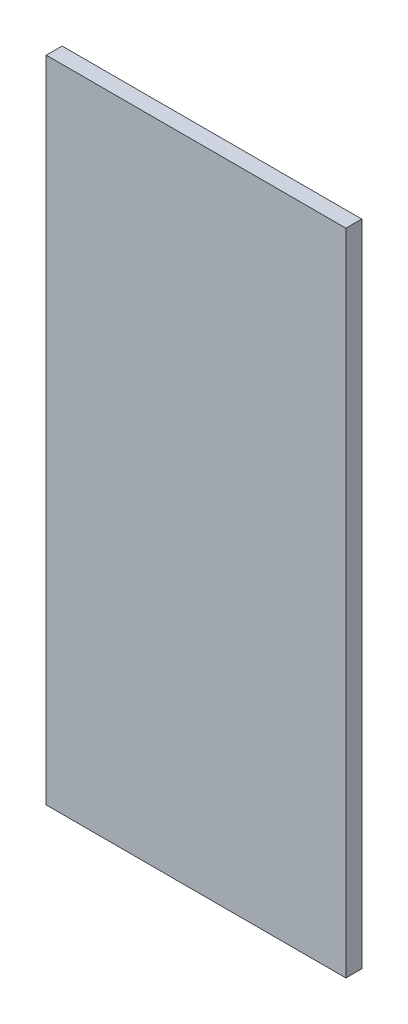
ISO-10303-21;
HEADER;
FILE_DESCRIPTION(('STEP AP214'),'2;1');
FILE_NAME('part.step','',(''),(''),'','','');
FILE_SCHEMA(('AUTOMOTIVE_DESIGN { 1 0 10303 214 1 1 1 1 }'));
ENDSEC;
DATA;
#1=APPLICATION_CONTEXT('core data for automotive mechanical design processes');
#2=APPLICATION_PROTOCOL_DEFINITION('international standard','automotive_design',2000,#1);
#3=PRODUCT_CONTEXT('',#1,'mechanical');
#4=PRODUCT('Part','Part','',(#3));
#5=PRODUCT_RELATED_PRODUCT_CATEGORY('part','',(#4));
#6=PRODUCT_DEFINITION_FORMATION('','',#4);
#7=PRODUCT_DEFINITION_CONTEXT('part definition',#1,'design');
#8=PRODUCT_DEFINITION('design','',#6,#7);
#9=PRODUCT_DEFINITION_SHAPE('','',#8);
#10=(LENGTH_UNIT() NAMED_UNIT(*) SI_UNIT(.MILLI.,.METRE.));
#11=(NAMED_UNIT(*) PLANE_ANGLE_UNIT() SI_UNIT($,.RADIAN.));
#12=(NAMED_UNIT(*) SI_UNIT($,.STERADIAN.) SOLID_ANGLE_UNIT());
#13=UNCERTAINTY_MEASURE_WITH_UNIT(LENGTH_MEASURE(1.E-05),#10,'distance_accuracy_value','');
#14=(GEOMETRIC_REPRESENTATION_CONTEXT(3) GLOBAL_UNCERTAINTY_ASSIGNED_CONTEXT((#13)) GLOBAL_UNIT_ASSIGNED_CONTEXT((#10,
#11,#12)) REPRESENTATION_CONTEXT('',''));
#15=CARTESIAN_POINT('',(0.,0.,0.));
#16=DIRECTION('',(0.,0.,1.));
#17=DIRECTION('',(1.,0.,0.));
#18=AXIS2_PLACEMENT_3D('',#15,#16,#17);
#19=CARTESIAN_POINT('',(30.,-65.,-3.175));
#20=DIRECTION('',(1.,0.,0.));
#21=DIRECTION('',(0.,0.,-1.));
#22=AXIS2_PLACEMENT_3D('',#19,#20,#21);
#23=PLANE('',#22);
#24=DIRECTION('',(0.,1.,0.));
#25=VECTOR('',#24,1.);
#26=CARTESIAN_POINT('',(30.,-65.,0.));
#27=LINE('',#26,#25);
#28=CARTESIAN_POINT('',(30.,-65.,0.));
#29=VERTEX_POINT('',#28);
#30=CARTESIAN_POINT('',(30.,65.,0.));
#31=VERTEX_POINT('',#30);
#32=EDGE_CURVE('E105',#29,#31,#27,.T.);
#33=ORIENTED_EDGE('',*,*,#32,.F.);
#34=DIRECTION('',(0.,0.,1.));
#35=VECTOR('',#34,1.);
#36=CARTESIAN_POINT('',(30.,-65.,-3.175));
#37=LINE('',#36,#35);
#38=CARTESIAN_POINT('',(30.,-65.,-3.175));
#39=VERTEX_POINT('',#38);
#40=EDGE_CURVE('E11',#39,#29,#37,.T.);
#41=ORIENTED_EDGE('',*,*,#40,.F.);
#42=DIRECTION('',(0.,1.,0.));
#43=VECTOR('',#42,1.);
#44=CARTESIAN_POINT('',(30.,-65.,-3.175));
#45=LINE('',#44,#43);
#46=CARTESIAN_POINT('',(30.,65.,-3.175));
#47=VERTEX_POINT('',#46);
#48=EDGE_CURVE('E99',#39,#47,#45,.T.);
#49=ORIENTED_EDGE('',*,*,#48,.T.);
#50=DIRECTION('',(0.,0.,1.));
#51=VECTOR('',#50,1.);
#52=CARTESIAN_POINT('',(30.,65.,-3.175));
#53=LINE('',#52,#51);
#54=EDGE_CURVE('E44',#47,#31,#53,.T.);
#55=ORIENTED_EDGE('',*,*,#54,.T.);
#56=EDGE_LOOP('',(#33,#41,#49,#55));
#57=FACE_BOUND('',#56,.T.);
#58=ADVANCED_FACE('F41',(#57),#23,.T.);
#59=CARTESIAN_POINT('',(-30.,-65.,-3.175));
#60=DIRECTION('',(0.,-1.,0.));
#61=DIRECTION('',(0.,0.,-1.));
#62=AXIS2_PLACEMENT_3D('',#59,#60,#61);
#63=PLANE('',#62);
#64=DIRECTION('',(1.,0.,0.));
#65=VECTOR('',#64,1.);
#66=CARTESIAN_POINT('',(-30.,-65.,0.));
#67=LINE('',#66,#65);
#68=CARTESIAN_POINT('',(-30.,-65.,0.));
#69=VERTEX_POINT('',#68);
#70=EDGE_CURVE('E101',#69,#29,#67,.T.);
#71=ORIENTED_EDGE('',*,*,#70,.F.);
#72=DIRECTION('',(0.,0.,1.));
#73=VECTOR('',#72,1.);
#74=CARTESIAN_POINT('',(-30.,-65.,-3.175));
#75=LINE('',#74,#73);
#76=CARTESIAN_POINT('',(-30.,-65.,-3.175));
#77=VERTEX_POINT('',#76);
#78=EDGE_CURVE('E50',#77,#69,#75,.T.);
#79=ORIENTED_EDGE('',*,*,#78,.F.);
#80=DIRECTION('',(1.,0.,0.));
#81=VECTOR('',#80,1.);
#82=CARTESIAN_POINT('',(-30.,-65.,-3.175));
#83=LINE('',#82,#81);
#84=EDGE_CURVE('E96',#77,#39,#83,.T.);
#85=ORIENTED_EDGE('',*,*,#84,.T.);
#86=ORIENTED_EDGE('',*,*,#40,.T.);
#87=EDGE_LOOP('',(#71,#79,#85,#86));
#88=FACE_BOUND('',#87,.T.);
#89=ADVANCED_FACE('F115',(#88),#63,.T.);
#90=CARTESIAN_POINT('',(-30.,-65.,-3.175));
#91=DIRECTION('',(-1.,0.,0.));
#92=DIRECTION('',(0.,0.,1.));
#93=AXIS2_PLACEMENT_3D('',#90,#91,#92);
#94=PLANE('',#93);
#95=DIRECTION('',(0.,-1.,0.));
#96=VECTOR('',#95,1.);
#97=CARTESIAN_POINT('',(-30.,-65.,0.));
#98=LINE('',#97,#96);
#99=CARTESIAN_POINT('',(-30.,65.,0.));
#100=VERTEX_POINT('',#99);
#101=EDGE_CURVE('E91',#100,#69,#98,.T.);
#102=ORIENTED_EDGE('',*,*,#101,.F.);
#103=DIRECTION('',(0.,0.,1.));
#104=VECTOR('',#103,1.);
#105=CARTESIAN_POINT('',(-30.,65.,-3.175));
#106=LINE('',#105,#104);
#107=CARTESIAN_POINT('',(-30.,65.,-3.175));
#108=VERTEX_POINT('',#107);
#109=EDGE_CURVE('E86',#108,#100,#106,.T.);
#110=ORIENTED_EDGE('',*,*,#109,.F.);
#111=DIRECTION('',(0.,-1.,0.));
#112=VECTOR('',#111,1.);
#113=CARTESIAN_POINT('',(-30.,-65.,-3.175));
#114=LINE('',#113,#112);
#115=EDGE_CURVE('E89',#108,#77,#114,.T.);
#116=ORIENTED_EDGE('',*,*,#115,.T.);
#117=ORIENTED_EDGE('',*,*,#78,.T.);
#118=EDGE_LOOP('',(#102,#110,#116,#117));
#119=FACE_BOUND('',#118,.T.);
#120=ADVANCED_FACE('F88',(#119),#94,.T.);
#121=CARTESIAN_POINT('',(-30.,65.,-3.175));
#122=DIRECTION('',(0.,1.,0.));
#123=DIRECTION('',(0.,0.,1.));
#124=AXIS2_PLACEMENT_3D('',#121,#122,#123);
#125=PLANE('',#124);
#126=DIRECTION('',(-1.,0.,0.));
#127=VECTOR('',#126,1.);
#128=CARTESIAN_POINT('',(-30.,65.,0.));
#129=LINE('',#128,#127);
#130=EDGE_CURVE('E108',#31,#100,#129,.T.);
#131=ORIENTED_EDGE('',*,*,#130,.F.);
#132=ORIENTED_EDGE('',*,*,#54,.F.);
#133=DIRECTION('',(-1.,0.,0.));
#134=VECTOR('',#133,1.);
#135=CARTESIAN_POINT('',(-30.,65.,-3.175));
#136=LINE('',#135,#134);
#137=EDGE_CURVE('E95',#47,#108,#136,.T.);
#138=ORIENTED_EDGE('',*,*,#137,.T.);
#139=ORIENTED_EDGE('',*,*,#109,.T.);
#140=EDGE_LOOP('',(#131,#132,#138,#139));
#141=FACE_BOUND('',#140,.T.);
#142=ADVANCED_FACE('F98',(#141),#125,.T.);
#143=CARTESIAN_POINT('',(0.,0.,-3.175));
#144=DIRECTION('',(0.,0.,-1.));
#145=DIRECTION('',(-1.,0.,0.));
#146=AXIS2_PLACEMENT_3D('',#143,#144,#145);
#147=PLANE('',#146);
#148=ORIENTED_EDGE('',*,*,#48,.F.);
#149=ORIENTED_EDGE('',*,*,#84,.F.);
#150=ORIENTED_EDGE('',*,*,#115,.F.);
#151=ORIENTED_EDGE('',*,*,#137,.F.);
#152=EDGE_LOOP('',(#148,#149,#150,#151));
#153=FACE_BOUND('',#152,.T.);
#154=ADVANCED_FACE('F94',(#153),#147,.T.);
#155=CARTESIAN_POINT('',(0.,0.,0.));
#156=DIRECTION('',(0.,0.,-1.));
#157=DIRECTION('',(-1.,0.,0.));
#158=AXIS2_PLACEMENT_3D('',#155,#156,#157);
#159=PLANE('',#158);
#160=ORIENTED_EDGE('',*,*,#32,.T.);
#161=ORIENTED_EDGE('',*,*,#130,.T.);
#162=ORIENTED_EDGE('',*,*,#101,.T.);
#163=ORIENTED_EDGE('',*,*,#70,.T.);
#164=EDGE_LOOP('',(#160,#161,#162,#163));
#165=FACE_BOUND('',#164,.T.);
#166=ADVANCED_FACE('F114',(#165),#159,.F.);
#167=CLOSED_SHELL('',(#58,#89,#120,#142,#154,#166));
#168=MANIFOLD_SOLID_BREP('B2',#167);
#169=ADVANCED_BREP_SHAPE_REPRESENTATION('',(#18,#168),#14);
#170=SHAPE_DEFINITION_REPRESENTATION(#9,#169);
ENDSEC;
END-ISO-10303-21;
